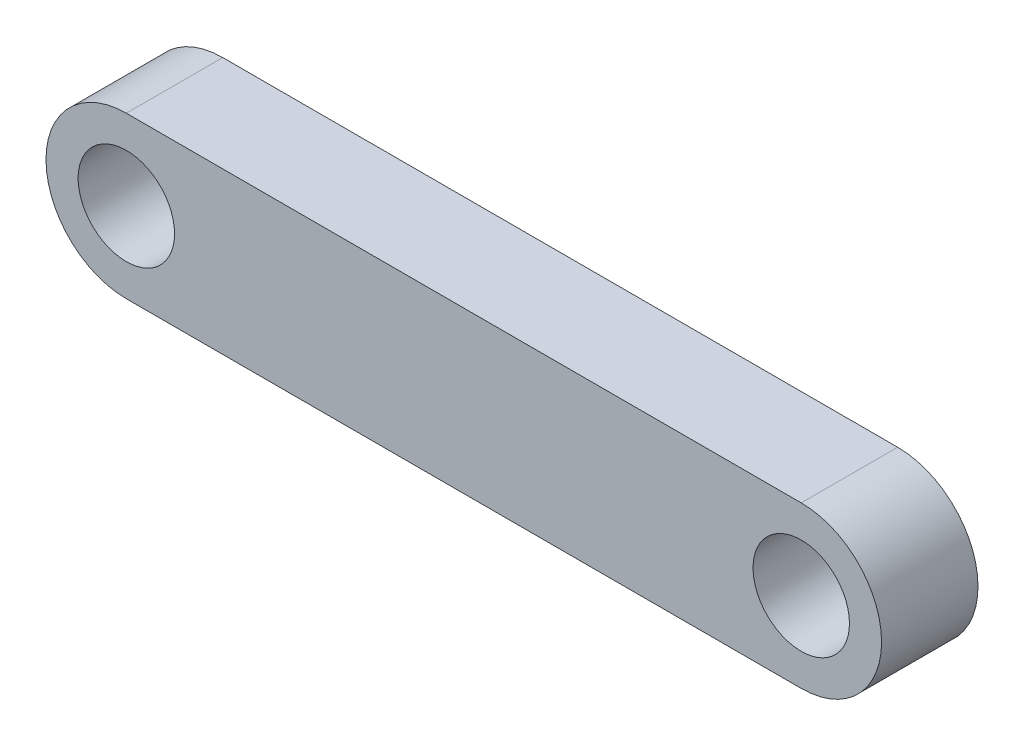
ISO-10303-21;
HEADER;
FILE_DESCRIPTION(('STEP AP214'),'2;1');
FILE_NAME('part.step','',(''),(''),'','','');
FILE_SCHEMA(('AUTOMOTIVE_DESIGN { 1 0 10303 214 1 1 1 1 }'));
ENDSEC;
DATA;
#1=APPLICATION_CONTEXT('core data for automotive mechanical design processes');
#2=APPLICATION_PROTOCOL_DEFINITION('international standard','automotive_design',2000,#1);
#3=PRODUCT_CONTEXT('',#1,'mechanical');
#4=PRODUCT('Part','Part','',(#3));
#5=PRODUCT_RELATED_PRODUCT_CATEGORY('part','',(#4));
#6=PRODUCT_DEFINITION_FORMATION('','',#4);
#7=PRODUCT_DEFINITION_CONTEXT('part definition',#1,'design');
#8=PRODUCT_DEFINITION('design','',#6,#7);
#9=PRODUCT_DEFINITION_SHAPE('','',#8);
#10=(LENGTH_UNIT() NAMED_UNIT(*) SI_UNIT(.MILLI.,.METRE.));
#11=(NAMED_UNIT(*) PLANE_ANGLE_UNIT() SI_UNIT($,.RADIAN.));
#12=(NAMED_UNIT(*) SI_UNIT($,.STERADIAN.) SOLID_ANGLE_UNIT());
#13=UNCERTAINTY_MEASURE_WITH_UNIT(LENGTH_MEASURE(1.E-05),#10,'distance_accuracy_value','');
#14=(GEOMETRIC_REPRESENTATION_CONTEXT(3) GLOBAL_UNCERTAINTY_ASSIGNED_CONTEXT((#13)) GLOBAL_UNIT_ASSIGNED_CONTEXT((#10,
#11,#12)) REPRESENTATION_CONTEXT('',''));
#15=CARTESIAN_POINT('',(0.,0.,0.));
#16=DIRECTION('',(0.,0.,1.));
#17=DIRECTION('',(1.,0.,0.));
#18=AXIS2_PLACEMENT_3D('',#15,#16,#17);
#19=CARTESIAN_POINT('',(0.,2.5,3.));
#20=DIRECTION('',(0.,0.,1.));
#21=DIRECTION('',(1.,0.,0.));
#22=AXIS2_PLACEMENT_3D('',#19,#20,#21);
#23=PLANE('',#22);
#24=CARTESIAN_POINT('',(21.,2.50000000000001,3.));
#25=DIRECTION('',(0.,0.,1.));
#26=DIRECTION('',(1.,0.,0.));
#27=AXIS2_PLACEMENT_3D('',#24,#25,#26);
#28=CIRCLE('',#27,1.5);
#29=CARTESIAN_POINT('',(22.5,2.50000000000001,3.));
#30=VERTEX_POINT('',#29);
#31=EDGE_CURVE('E100',#30,#30,#28,.T.);
#32=ORIENTED_EDGE('',*,*,#31,.F.);
#33=EDGE_LOOP('',(#32));
#34=FACE_BOUND('',#33,.T.);
#35=CARTESIAN_POINT('',(0.,2.5,3.));
#36=DIRECTION('',(0.,0.,1.));
#37=DIRECTION('',(1.,0.,0.));
#38=AXIS2_PLACEMENT_3D('',#35,#36,#37);
#39=CIRCLE('',#38,2.5);
#40=CARTESIAN_POINT('',(0.,5.,3.));
#41=VERTEX_POINT('',#40);
#42=CARTESIAN_POINT('',(0.,0.,3.));
#43=VERTEX_POINT('',#42);
#44=EDGE_CURVE('E85',#41,#43,#39,.T.);
#45=ORIENTED_EDGE('',*,*,#44,.T.);
#46=DIRECTION('',(1.,0.,0.));
#47=VECTOR('',#46,1.);
#48=CARTESIAN_POINT('',(0.,0.,3.));
#49=LINE('',#48,#47);
#50=CARTESIAN_POINT('',(21.,0.,3.));
#51=VERTEX_POINT('',#50);
#52=EDGE_CURVE('E80',#43,#51,#49,.T.);
#53=ORIENTED_EDGE('',*,*,#52,.T.);
#54=CARTESIAN_POINT('',(21.,2.50000000000001,3.));
#55=DIRECTION('',(0.,0.,1.));
#56=DIRECTION('',(-1.,0.,0.));
#57=AXIS2_PLACEMENT_3D('',#54,#55,#56);
#58=CIRCLE('',#57,2.49999999999999);
#59=CARTESIAN_POINT('',(21.,5.,3.));
#60=VERTEX_POINT('',#59);
#61=EDGE_CURVE('E83',#51,#60,#58,.T.);
#62=ORIENTED_EDGE('',*,*,#61,.T.);
#63=DIRECTION('',(-1.,0.,0.));
#64=VECTOR('',#63,1.);
#65=CARTESIAN_POINT('',(0.,5.,3.));
#66=LINE('',#65,#64);
#67=EDGE_CURVE('E50',#60,#41,#66,.T.);
#68=ORIENTED_EDGE('',*,*,#67,.T.);
#69=EDGE_LOOP('',(#45,#53,#62,#68));
#70=FACE_BOUND('',#69,.T.);
#71=CARTESIAN_POINT('',(0.,2.5,3.));
#72=DIRECTION('',(0.,0.,1.));
#73=DIRECTION('',(1.,0.,0.));
#74=AXIS2_PLACEMENT_3D('',#71,#72,#73);
#75=CIRCLE('',#74,1.5);
#76=CARTESIAN_POINT('',(1.5,2.5,3.));
#77=VERTEX_POINT('',#76);
#78=EDGE_CURVE('E115',#77,#77,#75,.T.);
#79=ORIENTED_EDGE('',*,*,#78,.F.);
#80=EDGE_LOOP('',(#79));
#81=FACE_BOUND('',#80,.T.);
#82=ADVANCED_FACE('F33',(#34,#70,#81),#23,.T.);
#83=CARTESIAN_POINT('',(0.,2.5,0.));
#84=DIRECTION('',(0.,0.,1.));
#85=DIRECTION('',(1.,0.,0.));
#86=AXIS2_PLACEMENT_3D('',#83,#84,#85);
#87=PLANE('',#86);
#88=CARTESIAN_POINT('',(0.,2.5,0.));
#89=DIRECTION('',(0.,0.,1.));
#90=DIRECTION('',(1.,0.,0.));
#91=AXIS2_PLACEMENT_3D('',#88,#89,#90);
#92=CIRCLE('',#91,2.5);
#93=CARTESIAN_POINT('',(0.,5.,0.));
#94=VERTEX_POINT('',#93);
#95=CARTESIAN_POINT('',(0.,0.,0.));
#96=VERTEX_POINT('',#95);
#97=EDGE_CURVE('E97',#94,#96,#92,.T.);
#98=ORIENTED_EDGE('',*,*,#97,.F.);
#99=DIRECTION('',(-1.,0.,0.));
#100=VECTOR('',#99,1.);
#101=CARTESIAN_POINT('',(0.,5.,0.));
#102=LINE('',#101,#100);
#103=CARTESIAN_POINT('',(21.,5.,0.));
#104=VERTEX_POINT('',#103);
#105=EDGE_CURVE('E73',#104,#94,#102,.T.);
#106=ORIENTED_EDGE('',*,*,#105,.F.);
#107=CARTESIAN_POINT('',(21.,2.50000000000001,0.));
#108=DIRECTION('',(0.,0.,1.));
#109=DIRECTION('',(-1.,0.,0.));
#110=AXIS2_PLACEMENT_3D('',#107,#108,#109);
#111=CIRCLE('',#110,2.49999999999999);
#112=CARTESIAN_POINT('',(21.,0.,0.));
#113=VERTEX_POINT('',#112);
#114=EDGE_CURVE('E67',#113,#104,#111,.T.);
#115=ORIENTED_EDGE('',*,*,#114,.F.);
#116=DIRECTION('',(1.,0.,0.));
#117=VECTOR('',#116,1.);
#118=CARTESIAN_POINT('',(0.,0.,0.));
#119=LINE('',#118,#117);
#120=EDGE_CURVE('E89',#96,#113,#119,.T.);
#121=ORIENTED_EDGE('',*,*,#120,.F.);
#122=EDGE_LOOP('',(#98,#106,#115,#121));
#123=FACE_BOUND('',#122,.T.);
#124=CARTESIAN_POINT('',(21.,2.50000000000001,0.));
#125=DIRECTION('',(0.,0.,1.));
#126=DIRECTION('',(1.,0.,0.));
#127=AXIS2_PLACEMENT_3D('',#124,#125,#126);
#128=CIRCLE('',#127,1.5);
#129=CARTESIAN_POINT('',(22.5,2.50000000000001,0.));
#130=VERTEX_POINT('',#129);
#131=EDGE_CURVE('E112',#130,#130,#128,.T.);
#132=ORIENTED_EDGE('',*,*,#131,.T.);
#133=EDGE_LOOP('',(#132));
#134=FACE_BOUND('',#133,.T.);
#135=CARTESIAN_POINT('',(0.,2.5,0.));
#136=DIRECTION('',(0.,0.,1.));
#137=DIRECTION('',(1.,0.,0.));
#138=AXIS2_PLACEMENT_3D('',#135,#136,#137);
#139=CIRCLE('',#138,1.5);
#140=CARTESIAN_POINT('',(1.5,2.5,0.));
#141=VERTEX_POINT('',#140);
#142=EDGE_CURVE('E118',#141,#141,#139,.T.);
#143=ORIENTED_EDGE('',*,*,#142,.T.);
#144=EDGE_LOOP('',(#143));
#145=FACE_BOUND('',#144,.T.);
#146=ADVANCED_FACE('F108',(#123,#134,#145),#87,.F.);
#147=CARTESIAN_POINT('',(0.,2.5,3.));
#148=DIRECTION('',(0.,0.,-1.));
#149=DIRECTION('',(-1.,0.,0.));
#150=AXIS2_PLACEMENT_3D('',#147,#148,#149);
#151=CYLINDRICAL_SURFACE('',#150,2.5);
#152=ORIENTED_EDGE('',*,*,#97,.T.);
#153=DIRECTION('',(0.,0.,-1.));
#154=VECTOR('',#153,1.);
#155=CARTESIAN_POINT('',(0.,0.,3.));
#156=LINE('',#155,#154);
#157=EDGE_CURVE('E11',#43,#96,#156,.T.);
#158=ORIENTED_EDGE('',*,*,#157,.F.);
#159=ORIENTED_EDGE('',*,*,#44,.F.);
#160=DIRECTION('',(0.,0.,-1.));
#161=VECTOR('',#160,1.);
#162=CARTESIAN_POINT('',(0.,5.,3.));
#163=LINE('',#162,#161);
#164=EDGE_CURVE('E93',#41,#94,#163,.T.);
#165=ORIENTED_EDGE('',*,*,#164,.T.);
#166=EDGE_LOOP('',(#152,#158,#159,#165));
#167=FACE_BOUND('',#166,.T.);
#168=ADVANCED_FACE('F35',(#167),#151,.T.);
#169=CARTESIAN_POINT('',(0.,0.,3.));
#170=DIRECTION('',(0.,1.,0.));
#171=DIRECTION('',(-1.,0.,0.));
#172=AXIS2_PLACEMENT_3D('',#169,#170,#171);
#173=PLANE('',#172);
#174=ORIENTED_EDGE('',*,*,#120,.T.);
#175=DIRECTION('',(0.,0.,-1.));
#176=VECTOR('',#175,1.);
#177=CARTESIAN_POINT('',(21.,0.,3.));
#178=LINE('',#177,#176);
#179=EDGE_CURVE('E42',#51,#113,#178,.T.);
#180=ORIENTED_EDGE('',*,*,#179,.F.);
#181=ORIENTED_EDGE('',*,*,#52,.F.);
#182=ORIENTED_EDGE('',*,*,#157,.T.);
#183=EDGE_LOOP('',(#174,#180,#181,#182));
#184=FACE_BOUND('',#183,.T.);
#185=ADVANCED_FACE('F88',(#184),#173,.F.);
#186=CARTESIAN_POINT('',(21.,2.50000000000001,3.));
#187=DIRECTION('',(0.,0.,-1.));
#188=DIRECTION('',(-1.,0.,0.));
#189=AXIS2_PLACEMENT_3D('',#186,#187,#188);
#190=CYLINDRICAL_SURFACE('',#189,2.49999999999999);
#191=ORIENTED_EDGE('',*,*,#114,.T.);
#192=DIRECTION('',(0.,0.,-1.));
#193=VECTOR('',#192,1.);
#194=CARTESIAN_POINT('',(21.,5.,3.));
#195=LINE('',#194,#193);
#196=EDGE_CURVE('E90',#60,#104,#195,.T.);
#197=ORIENTED_EDGE('',*,*,#196,.F.);
#198=ORIENTED_EDGE('',*,*,#61,.F.);
#199=ORIENTED_EDGE('',*,*,#179,.T.);
#200=EDGE_LOOP('',(#191,#197,#198,#199));
#201=FACE_BOUND('',#200,.T.);
#202=ADVANCED_FACE('F91',(#201),#190,.T.);
#203=CARTESIAN_POINT('',(0.,5.,3.));
#204=DIRECTION('',(0.,-1.,0.));
#205=DIRECTION('',(1.,0.,0.));
#206=AXIS2_PLACEMENT_3D('',#203,#204,#205);
#207=PLANE('',#206);
#208=ORIENTED_EDGE('',*,*,#105,.T.);
#209=ORIENTED_EDGE('',*,*,#164,.F.);
#210=ORIENTED_EDGE('',*,*,#67,.F.);
#211=ORIENTED_EDGE('',*,*,#196,.T.);
#212=EDGE_LOOP('',(#208,#209,#210,#211));
#213=FACE_BOUND('',#212,.T.);
#214=ADVANCED_FACE('F105',(#213),#207,.F.);
#215=CARTESIAN_POINT('',(21.,2.50000000000001,3.));
#216=DIRECTION('',(0.,0.,-1.));
#217=DIRECTION('',(-1.,0.,0.));
#218=AXIS2_PLACEMENT_3D('',#215,#216,#217);
#219=CYLINDRICAL_SURFACE('',#218,1.5);
#220=ORIENTED_EDGE('',*,*,#31,.T.);
#221=EDGE_LOOP('',(#220));
#222=FACE_BOUND('',#221,.T.);
#223=ORIENTED_EDGE('',*,*,#131,.F.);
#224=EDGE_LOOP('',(#223));
#225=FACE_BOUND('',#224,.T.);
#226=ADVANCED_FACE('F135',(#222,#225),#219,.F.);
#227=CARTESIAN_POINT('',(0.,2.5,3.));
#228=DIRECTION('',(0.,0.,-1.));
#229=DIRECTION('',(-1.,0.,0.));
#230=AXIS2_PLACEMENT_3D('',#227,#228,#229);
#231=CYLINDRICAL_SURFACE('',#230,1.5);
#232=ORIENTED_EDGE('',*,*,#78,.T.);
#233=EDGE_LOOP('',(#232));
#234=FACE_BOUND('',#233,.T.);
#235=ORIENTED_EDGE('',*,*,#142,.F.);
#236=EDGE_LOOP('',(#235));
#237=FACE_BOUND('',#236,.T.);
#238=ADVANCED_FACE('F124',(#234,#237),#231,.F.);
#239=CLOSED_SHELL('',(#82,#146,#168,#185,#202,#214,#226,#238));
#240=MANIFOLD_SOLID_BREP('B2',#239);
#241=ADVANCED_BREP_SHAPE_REPRESENTATION('',(#18,#240),#14);
#242=SHAPE_DEFINITION_REPRESENTATION(#9,#241);
ENDSEC;
END-ISO-10303-21;
